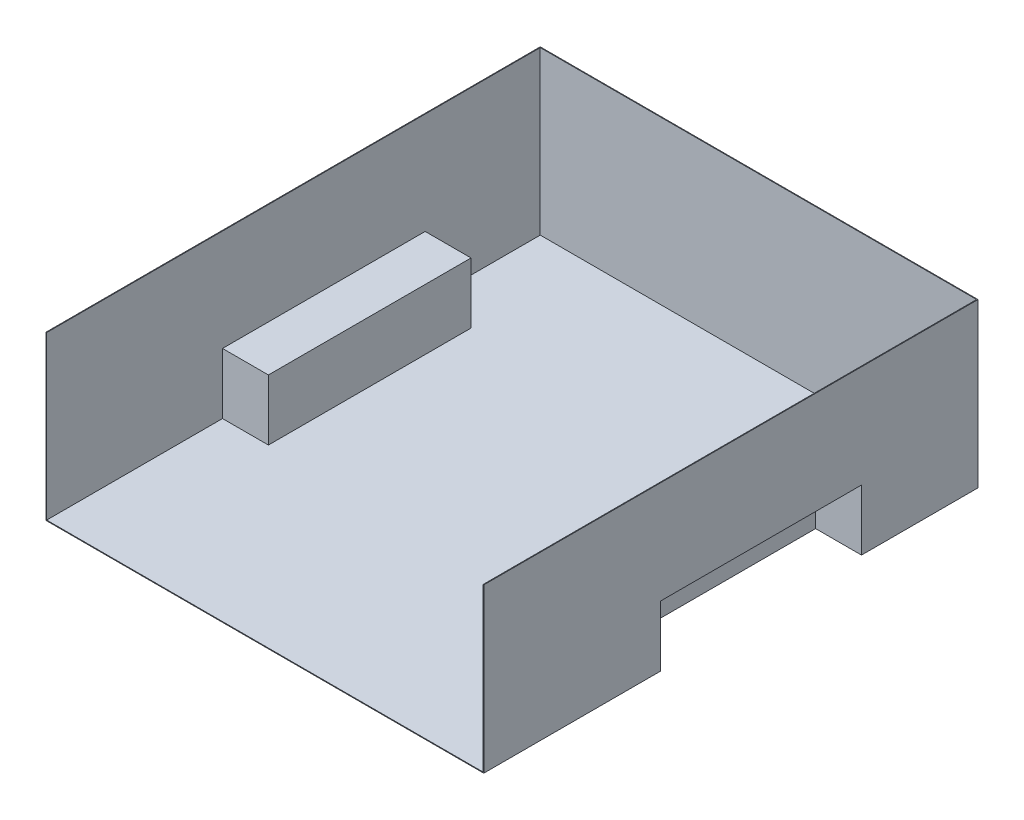
ISO-10303-21;
HEADER;
FILE_DESCRIPTION(('STEP AP214'),'2;1');
FILE_NAME('part.step','',(''),(''),'','','');
FILE_SCHEMA(('AUTOMOTIVE_DESIGN { 1 0 10303 214 1 1 1 1 }'));
ENDSEC;
DATA;
#1=APPLICATION_CONTEXT('core data for automotive mechanical design processes');
#2=APPLICATION_PROTOCOL_DEFINITION('international standard','automotive_design',2000,#1);
#3=PRODUCT_CONTEXT('',#1,'mechanical');
#4=PRODUCT('Part','Part','',(#3));
#5=PRODUCT_RELATED_PRODUCT_CATEGORY('part','',(#4));
#6=PRODUCT_DEFINITION_FORMATION('','',#4);
#7=PRODUCT_DEFINITION_CONTEXT('part definition',#1,'design');
#8=PRODUCT_DEFINITION('design','',#6,#7);
#9=PRODUCT_DEFINITION_SHAPE('','',#8);
#10=(LENGTH_UNIT() NAMED_UNIT(*) SI_UNIT(.MILLI.,.METRE.));
#11=(NAMED_UNIT(*) PLANE_ANGLE_UNIT() SI_UNIT($,.RADIAN.));
#12=(NAMED_UNIT(*) SI_UNIT($,.STERADIAN.) SOLID_ANGLE_UNIT());
#13=UNCERTAINTY_MEASURE_WITH_UNIT(LENGTH_MEASURE(1.E-05),#10,'distance_accuracy_value','');
#14=(GEOMETRIC_REPRESENTATION_CONTEXT(3) GLOBAL_UNCERTAINTY_ASSIGNED_CONTEXT((#13)) GLOBAL_UNIT_ASSIGNED_CONTEXT((#10,
#11,#12)) REPRESENTATION_CONTEXT('',''));
#15=CARTESIAN_POINT('',(0.,0.,0.));
#16=DIRECTION('',(0.,0.,1.));
#17=DIRECTION('',(1.,0.,0.));
#18=AXIS2_PLACEMENT_3D('',#15,#16,#17);
#19=CARTESIAN_POINT('',(-787.4,215.9,-889.));
#20=DIRECTION('',(0.,0.,1.));
#21=DIRECTION('',(1.,0.,0.));
#22=AXIS2_PLACEMENT_3D('',#19,#20,#21);
#23=PLANE('',#22);
#24=DIRECTION('',(0.,-1.,0.));
#25=VECTOR('',#24,1.);
#26=CARTESIAN_POINT('',(787.4,215.9,-889.));
#27=LINE('',#26,#25);
#28=CARTESIAN_POINT('',(787.4,584.2,-889.));
#29=VERTEX_POINT('',#28);
#30=CARTESIAN_POINT('',(787.4,-2.54,-889.));
#31=VERTEX_POINT('',#30);
#32=EDGE_CURVE('E114',#29,#31,#27,.T.);
#33=ORIENTED_EDGE('',*,*,#32,.T.);
#34=DIRECTION('',(1.,0.,0.));
#35=VECTOR('',#34,1.);
#36=CARTESIAN_POINT('',(-787.4,-2.54,-889.));
#37=LINE('',#36,#35);
#38=CARTESIAN_POINT('',(-787.4,-2.54,-889.));
#39=VERTEX_POINT('',#38);
#40=EDGE_CURVE('E298',#39,#31,#37,.T.);
#41=ORIENTED_EDGE('',*,*,#40,.F.);
#42=DIRECTION('',(0.,-1.,0.));
#43=VECTOR('',#42,1.);
#44=CARTESIAN_POINT('',(-787.4,215.9,-889.));
#45=LINE('',#44,#43);
#46=CARTESIAN_POINT('',(-787.4,584.2,-889.));
#47=VERTEX_POINT('',#46);
#48=EDGE_CURVE('E453',#47,#39,#45,.T.);
#49=ORIENTED_EDGE('',*,*,#48,.F.);
#50=DIRECTION('',(-1.,0.,0.));
#51=VECTOR('',#50,1.);
#52=CARTESIAN_POINT('',(-787.4,584.2,-889.));
#53=LINE('',#52,#51);
#54=EDGE_CURVE('E352',#29,#47,#53,.T.);
#55=ORIENTED_EDGE('',*,*,#54,.F.);
#56=EDGE_LOOP('',(#33,#41,#49,#55));
#57=FACE_BOUND('',#56,.T.);
#58=ADVANCED_FACE('F107',(#57),#23,.F.);
#59=CARTESIAN_POINT('',(-787.4,215.9,-469.9));
#60=DIRECTION('',(0.,0.,-1.));
#61=DIRECTION('',(-1.,0.,0.));
#62=AXIS2_PLACEMENT_3D('',#59,#60,#61);
#63=PLANE('',#62);
#64=DIRECTION('',(0.,-1.,0.));
#65=VECTOR('',#64,1.);
#66=CARTESIAN_POINT('',(-787.4,215.9,-469.9));
#67=LINE('',#66,#65);
#68=CARTESIAN_POINT('',(-787.4,215.9,-469.9));
#69=VERTEX_POINT('',#68);
#70=CARTESIAN_POINT('',(-787.4,-2.54,-469.9));
#71=VERTEX_POINT('',#70);
#72=EDGE_CURVE('E451',#69,#71,#67,.T.);
#73=ORIENTED_EDGE('',*,*,#72,.T.);
#74=DIRECTION('',(-1.,0.,0.));
#75=VECTOR('',#74,1.);
#76=CARTESIAN_POINT('',(-622.3,-2.54,-469.9));
#77=LINE('',#76,#75);
#78=CARTESIAN_POINT('',(-622.3,-2.54,-469.9));
#79=VERTEX_POINT('',#78);
#80=EDGE_CURVE('E330',#79,#71,#77,.T.);
#81=ORIENTED_EDGE('',*,*,#80,.F.);
#82=DIRECTION('',(0.,-1.,0.));
#83=VECTOR('',#82,1.);
#84=CARTESIAN_POINT('',(-622.3,215.9,-469.9));
#85=LINE('',#84,#83);
#86=CARTESIAN_POINT('',(-622.3,215.9,-469.9));
#87=VERTEX_POINT('',#86);
#88=EDGE_CURVE('E449',#87,#79,#85,.T.);
#89=ORIENTED_EDGE('',*,*,#88,.F.);
#90=DIRECTION('',(1.,0.,0.));
#91=VECTOR('',#90,1.);
#92=CARTESIAN_POINT('',(-787.4,215.9,-469.9));
#93=LINE('',#92,#91);
#94=EDGE_CURVE('E420',#69,#87,#93,.T.);
#95=ORIENTED_EDGE('',*,*,#94,.F.);
#96=EDGE_LOOP('',(#73,#81,#89,#95));
#97=FACE_BOUND('',#96,.T.);
#98=ADVANCED_FACE('F490',(#97),#63,.F.);
#99=CARTESIAN_POINT('',(-622.3,215.9,-469.9));
#100=DIRECTION('',(1.,0.,0.));
#101=DIRECTION('',(0.,0.,-1.));
#102=AXIS2_PLACEMENT_3D('',#99,#100,#101);
#103=PLANE('',#102);
#104=ORIENTED_EDGE('',*,*,#88,.T.);
#105=DIRECTION('',(0.,0.,-1.));
#106=VECTOR('',#105,1.);
#107=CARTESIAN_POINT('',(-622.3,-2.54,254.));
#108=LINE('',#107,#106);
#109=CARTESIAN_POINT('',(-622.3,-2.54,254.));
#110=VERTEX_POINT('',#109);
#111=EDGE_CURVE('E327',#110,#79,#108,.T.);
#112=ORIENTED_EDGE('',*,*,#111,.F.);
#113=DIRECTION('',(0.,-1.,0.));
#114=VECTOR('',#113,1.);
#115=CARTESIAN_POINT('',(-622.3,215.9,254.));
#116=LINE('',#115,#114);
#117=CARTESIAN_POINT('',(-622.3,215.9,254.));
#118=VERTEX_POINT('',#117);
#119=EDGE_CURVE('E447',#118,#110,#116,.T.);
#120=ORIENTED_EDGE('',*,*,#119,.F.);
#121=DIRECTION('',(0.,0.,1.));
#122=VECTOR('',#121,1.);
#123=CARTESIAN_POINT('',(-622.3,215.9,-469.9));
#124=LINE('',#123,#122);
#125=EDGE_CURVE('E422',#87,#118,#124,.T.);
#126=ORIENTED_EDGE('',*,*,#125,.F.);
#127=EDGE_LOOP('',(#104,#112,#120,#126));
#128=FACE_BOUND('',#127,.T.);
#129=ADVANCED_FACE('F487',(#128),#103,.F.);
#130=CARTESIAN_POINT('',(-622.3,215.9,254.));
#131=DIRECTION('',(0.,0.,1.));
#132=DIRECTION('',(1.,0.,0.));
#133=AXIS2_PLACEMENT_3D('',#130,#131,#132);
#134=PLANE('',#133);
#135=ORIENTED_EDGE('',*,*,#119,.T.);
#136=DIRECTION('',(1.,0.,0.));
#137=VECTOR('',#136,1.);
#138=CARTESIAN_POINT('',(-787.4,-2.54,254.));
#139=LINE('',#138,#137);
#140=CARTESIAN_POINT('',(-787.4,-2.54,254.));
#141=VERTEX_POINT('',#140);
#142=EDGE_CURVE('E324',#141,#110,#139,.T.);
#143=ORIENTED_EDGE('',*,*,#142,.F.);
#144=DIRECTION('',(0.,-1.,0.));
#145=VECTOR('',#144,1.);
#146=CARTESIAN_POINT('',(-787.4,215.9,254.));
#147=LINE('',#146,#145);
#148=CARTESIAN_POINT('',(-787.4,215.9,254.));
#149=VERTEX_POINT('',#148);
#150=EDGE_CURVE('E445',#149,#141,#147,.T.);
#151=ORIENTED_EDGE('',*,*,#150,.F.);
#152=DIRECTION('',(-1.,0.,0.));
#153=VECTOR('',#152,1.);
#154=CARTESIAN_POINT('',(-622.3,215.9,254.));
#155=LINE('',#154,#153);
#156=EDGE_CURVE('E425',#118,#149,#155,.T.);
#157=ORIENTED_EDGE('',*,*,#156,.F.);
#158=EDGE_LOOP('',(#135,#143,#151,#157));
#159=FACE_BOUND('',#158,.T.);
#160=ADVANCED_FACE('F483',(#159),#134,.F.);
#161=CARTESIAN_POINT('',(-787.4,215.9,889.));
#162=DIRECTION('',(1.,0.,0.));
#163=DIRECTION('',(0.,0.,-1.));
#164=AXIS2_PLACEMENT_3D('',#161,#162,#163);
#165=PLANE('',#164);
#166=DIRECTION('',(0.,0.,1.));
#167=VECTOR('',#166,1.);
#168=CARTESIAN_POINT('',(-787.4,584.2,-889.));
#169=LINE('',#168,#167);
#170=CARTESIAN_POINT('',(-787.4,584.2,889.));
#171=VERTEX_POINT('',#170);
#172=EDGE_CURVE('E343',#47,#171,#169,.T.);
#173=ORIENTED_EDGE('',*,*,#172,.F.);
#174=ORIENTED_EDGE('',*,*,#48,.T.);
#175=DIRECTION('',(0.,0.,-1.));
#176=VECTOR('',#175,1.);
#177=CARTESIAN_POINT('',(-787.4,-2.54,-469.9));
#178=LINE('',#177,#176);
#179=EDGE_CURVE('E333',#71,#39,#178,.T.);
#180=ORIENTED_EDGE('',*,*,#179,.F.);
#181=ORIENTED_EDGE('',*,*,#72,.F.);
#182=DIRECTION('',(0.,0.,1.));
#183=VECTOR('',#182,1.);
#184=CARTESIAN_POINT('',(-787.4,215.9,-472.44));
#185=LINE('',#184,#183);
#186=EDGE_CURVE('E366',#69,#149,#185,.T.);
#187=ORIENTED_EDGE('',*,*,#186,.T.);
#188=ORIENTED_EDGE('',*,*,#150,.T.);
#189=DIRECTION('',(0.,0.,-1.));
#190=VECTOR('',#189,1.);
#191=CARTESIAN_POINT('',(-787.4,-2.54,889.));
#192=LINE('',#191,#190);
#193=CARTESIAN_POINT('',(-787.4,-2.54,889.));
#194=VERTEX_POINT('',#193);
#195=EDGE_CURVE('E321',#194,#141,#192,.T.);
#196=ORIENTED_EDGE('',*,*,#195,.F.);
#197=DIRECTION('',(0.,-1.,0.));
#198=VECTOR('',#197,1.);
#199=CARTESIAN_POINT('',(-787.4,215.9,889.));
#200=LINE('',#199,#198);
#201=EDGE_CURVE('E443',#171,#194,#200,.T.);
#202=ORIENTED_EDGE('',*,*,#201,.F.);
#203=EDGE_LOOP('',(#173,#174,#180,#181,#187,#188,#196,#202));
#204=FACE_BOUND('',#203,.T.);
#205=ADVANCED_FACE('F469',(#204),#165,.F.);
#206=CARTESIAN_POINT('',(-787.4,215.9,889.));
#207=DIRECTION('',(0.,0.,-1.));
#208=DIRECTION('',(-1.,0.,0.));
#209=AXIS2_PLACEMENT_3D('',#206,#207,#208);
#210=PLANE('',#209);
#211=DIRECTION('',(1.,0.,0.));
#212=VECTOR('',#211,1.);
#213=CARTESIAN_POINT('',(-787.4,584.2,889.));
#214=LINE('',#213,#212);
#215=CARTESIAN_POINT('',(784.86,584.2,889.));
#216=VERTEX_POINT('',#215);
#217=CARTESIAN_POINT('',(787.4,584.2,889.));
#218=VERTEX_POINT('',#217);
#219=EDGE_CURVE('E295',#216,#218,#214,.T.);
#220=ORIENTED_EDGE('',*,*,#219,.F.);
#221=DIRECTION('',(0.,1.,0.));
#222=VECTOR('',#221,1.);
#223=CARTESIAN_POINT('',(784.86,-1569.72205501484,889.));
#224=LINE('',#223,#222);
#225=CARTESIAN_POINT('',(784.86,0.,889.));
#226=VERTEX_POINT('',#225);
#227=EDGE_CURVE('E275',#226,#216,#224,.T.);
#228=ORIENTED_EDGE('',*,*,#227,.F.);
#229=DIRECTION('',(1.,0.,0.));
#230=VECTOR('',#229,1.);
#231=CARTESIAN_POINT('',(-784.86,0.,889.));
#232=LINE('',#231,#230);
#233=CARTESIAN_POINT('',(-784.86,0.,889.));
#234=VERTEX_POINT('',#233);
#235=EDGE_CURVE('E285',#234,#226,#232,.T.);
#236=ORIENTED_EDGE('',*,*,#235,.F.);
#237=DIRECTION('',(0.,1.,0.));
#238=VECTOR('',#237,1.);
#239=CARTESIAN_POINT('',(-784.86,-1569.72205501484,889.));
#240=LINE('',#239,#238);
#241=CARTESIAN_POINT('',(-784.86,584.2,889.));
#242=VERTEX_POINT('',#241);
#243=EDGE_CURVE('E296',#234,#242,#240,.T.);
#244=ORIENTED_EDGE('',*,*,#243,.T.);
#245=EDGE_CURVE('E346',#171,#242,#214,.T.);
#246=ORIENTED_EDGE('',*,*,#245,.F.);
#247=ORIENTED_EDGE('',*,*,#201,.T.);
#248=DIRECTION('',(-1.,0.,0.));
#249=VECTOR('',#248,1.);
#250=CARTESIAN_POINT('',(787.4,-2.54,889.));
#251=LINE('',#250,#249);
#252=CARTESIAN_POINT('',(787.4,-2.54,889.));
#253=VERTEX_POINT('',#252);
#254=EDGE_CURVE('E318',#253,#194,#251,.T.);
#255=ORIENTED_EDGE('',*,*,#254,.F.);
#256=DIRECTION('',(0.,-1.,0.));
#257=VECTOR('',#256,1.);
#258=CARTESIAN_POINT('',(787.4,215.9,889.));
#259=LINE('',#258,#257);
#260=EDGE_CURVE('E441',#218,#253,#259,.T.);
#261=ORIENTED_EDGE('',*,*,#260,.F.);
#262=EDGE_LOOP('',(#220,#228,#236,#244,#246,#247,#255,#261));
#263=FACE_BOUND('',#262,.T.);
#264=ADVANCED_FACE('F293',(#263),#210,.F.);
#265=CARTESIAN_POINT('',(787.4,215.9,889.));
#266=DIRECTION('',(-1.,0.,0.));
#267=DIRECTION('',(0.,0.,1.));
#268=AXIS2_PLACEMENT_3D('',#265,#266,#267);
#269=PLANE('',#268);
#270=DIRECTION('',(0.,0.,-1.));
#271=VECTOR('',#270,1.);
#272=CARTESIAN_POINT('',(787.4,584.2,-889.));
#273=LINE('',#272,#271);
#274=EDGE_CURVE('E349',#218,#29,#273,.T.);
#275=ORIENTED_EDGE('',*,*,#274,.F.);
#276=ORIENTED_EDGE('',*,*,#260,.T.);
#277=DIRECTION('',(0.,0.,1.));
#278=VECTOR('',#277,1.);
#279=CARTESIAN_POINT('',(787.4,-2.54,254.));
#280=LINE('',#279,#278);
#281=CARTESIAN_POINT('',(787.4,-2.54,254.));
#282=VERTEX_POINT('',#281);
#283=EDGE_CURVE('E315',#282,#253,#280,.T.);
#284=ORIENTED_EDGE('',*,*,#283,.F.);
#285=DIRECTION('',(0.,-1.,0.));
#286=VECTOR('',#285,1.);
#287=CARTESIAN_POINT('',(787.4,215.9,254.));
#288=LINE('',#287,#286);
#289=CARTESIAN_POINT('',(787.4,215.9,254.));
#290=VERTEX_POINT('',#289);
#291=EDGE_CURVE('E439',#290,#282,#288,.T.);
#292=ORIENTED_EDGE('',*,*,#291,.F.);
#293=DIRECTION('',(0.,0.,-1.));
#294=VECTOR('',#293,1.);
#295=CARTESIAN_POINT('',(787.4,215.9,-472.44));
#296=LINE('',#295,#294);
#297=CARTESIAN_POINT('',(787.4,215.9,-469.9));
#298=VERTEX_POINT('',#297);
#299=EDGE_CURVE('E357',#290,#298,#296,.T.);
#300=ORIENTED_EDGE('',*,*,#299,.T.);
#301=DIRECTION('',(0.,-1.,0.));
#302=VECTOR('',#301,1.);
#303=CARTESIAN_POINT('',(787.4,215.9,-469.9));
#304=LINE('',#303,#302);
#305=CARTESIAN_POINT('',(787.4,-2.54,-469.9));
#306=VERTEX_POINT('',#305);
#307=EDGE_CURVE('E433',#298,#306,#304,.T.);
#308=ORIENTED_EDGE('',*,*,#307,.T.);
#309=DIRECTION('',(0.,0.,1.));
#310=VECTOR('',#309,1.);
#311=CARTESIAN_POINT('',(787.4,-2.54,-889.));
#312=LINE('',#311,#310);
#313=EDGE_CURVE('E303',#31,#306,#312,.T.);
#314=ORIENTED_EDGE('',*,*,#313,.F.);
#315=ORIENTED_EDGE('',*,*,#32,.F.);
#316=EDGE_LOOP('',(#275,#276,#284,#292,#300,#308,#314,#315));
#317=FACE_BOUND('',#316,.T.);
#318=ADVANCED_FACE('F460',(#317),#269,.F.);
#319=CARTESIAN_POINT('',(787.4,215.9,254.));
#320=DIRECTION('',(0.,0.,1.));
#321=DIRECTION('',(1.,0.,0.));
#322=AXIS2_PLACEMENT_3D('',#319,#320,#321);
#323=PLANE('',#322);
#324=ORIENTED_EDGE('',*,*,#291,.T.);
#325=DIRECTION('',(1.,0.,0.));
#326=VECTOR('',#325,1.);
#327=CARTESIAN_POINT('',(622.3,-2.54,254.));
#328=LINE('',#327,#326);
#329=CARTESIAN_POINT('',(622.3,-2.54,254.));
#330=VERTEX_POINT('',#329);
#331=EDGE_CURVE('E312',#330,#282,#328,.T.);
#332=ORIENTED_EDGE('',*,*,#331,.F.);
#333=DIRECTION('',(0.,-1.,0.));
#334=VECTOR('',#333,1.);
#335=CARTESIAN_POINT('',(622.3,215.9,254.));
#336=LINE('',#335,#334);
#337=CARTESIAN_POINT('',(622.3,215.9,254.));
#338=VERTEX_POINT('',#337);
#339=EDGE_CURVE('E437',#338,#330,#336,.T.);
#340=ORIENTED_EDGE('',*,*,#339,.F.);
#341=DIRECTION('',(-1.,0.,0.));
#342=VECTOR('',#341,1.);
#343=CARTESIAN_POINT('',(787.4,215.9,254.));
#344=LINE('',#343,#342);
#345=EDGE_CURVE('E427',#290,#338,#344,.T.);
#346=ORIENTED_EDGE('',*,*,#345,.F.);
#347=EDGE_LOOP('',(#324,#332,#340,#346));
#348=FACE_BOUND('',#347,.T.);
#349=ADVANCED_FACE('F526',(#348),#323,.F.);
#350=CARTESIAN_POINT('',(622.3,215.9,254.));
#351=DIRECTION('',(-1.,0.,0.));
#352=DIRECTION('',(0.,0.,1.));
#353=AXIS2_PLACEMENT_3D('',#350,#351,#352);
#354=PLANE('',#353);
#355=ORIENTED_EDGE('',*,*,#339,.T.);
#356=DIRECTION('',(0.,0.,1.));
#357=VECTOR('',#356,1.);
#358=CARTESIAN_POINT('',(622.3,-2.54,-469.9));
#359=LINE('',#358,#357);
#360=CARTESIAN_POINT('',(622.3,-2.54,-469.9));
#361=VERTEX_POINT('',#360);
#362=EDGE_CURVE('E309',#361,#330,#359,.T.);
#363=ORIENTED_EDGE('',*,*,#362,.F.);
#364=DIRECTION('',(0.,-1.,0.));
#365=VECTOR('',#364,1.);
#366=CARTESIAN_POINT('',(622.3,215.9,-469.9));
#367=LINE('',#366,#365);
#368=CARTESIAN_POINT('',(622.3,215.9,-469.9));
#369=VERTEX_POINT('',#368);
#370=EDGE_CURVE('E435',#369,#361,#367,.T.);
#371=ORIENTED_EDGE('',*,*,#370,.F.);
#372=DIRECTION('',(0.,0.,-1.));
#373=VECTOR('',#372,1.);
#374=CARTESIAN_POINT('',(622.3,215.9,254.));
#375=LINE('',#374,#373);
#376=EDGE_CURVE('E429',#338,#369,#375,.T.);
#377=ORIENTED_EDGE('',*,*,#376,.F.);
#378=EDGE_LOOP('',(#355,#363,#371,#377));
#379=FACE_BOUND('',#378,.T.);
#380=ADVANCED_FACE('F529',(#379),#354,.F.);
#381=CARTESIAN_POINT('',(622.3,215.9,-469.9));
#382=DIRECTION('',(0.,0.,-1.));
#383=DIRECTION('',(-1.,0.,0.));
#384=AXIS2_PLACEMENT_3D('',#381,#382,#383);
#385=PLANE('',#384);
#386=ORIENTED_EDGE('',*,*,#370,.T.);
#387=DIRECTION('',(-1.,0.,0.));
#388=VECTOR('',#387,1.);
#389=CARTESIAN_POINT('',(787.4,-2.54,-469.9));
#390=LINE('',#389,#388);
#391=EDGE_CURVE('E306',#306,#361,#390,.T.);
#392=ORIENTED_EDGE('',*,*,#391,.F.);
#393=ORIENTED_EDGE('',*,*,#307,.F.);
#394=DIRECTION('',(1.,0.,0.));
#395=VECTOR('',#394,1.);
#396=CARTESIAN_POINT('',(622.3,215.9,-469.9));
#397=LINE('',#396,#395);
#398=EDGE_CURVE('E431',#369,#298,#397,.T.);
#399=ORIENTED_EDGE('',*,*,#398,.F.);
#400=EDGE_LOOP('',(#386,#392,#393,#399));
#401=FACE_BOUND('',#400,.T.);
#402=ADVANCED_FACE('F533',(#401),#385,.F.);
#403=CARTESIAN_POINT('',(784.86,215.9,0.));
#404=DIRECTION('',(-1.,0.,0.));
#405=DIRECTION('',(0.,0.,1.));
#406=AXIS2_PLACEMENT_3D('',#403,#404,#405);
#407=PLANE('',#406);
#408=DIRECTION('',(0.,0.,-1.));
#409=VECTOR('',#408,1.);
#410=CARTESIAN_POINT('',(784.86,0.,0.));
#411=LINE('',#410,#409);
#412=CARTESIAN_POINT('',(784.86,0.,-472.44));
#413=VERTEX_POINT('',#412);
#414=CARTESIAN_POINT('',(784.86,0.,-886.46));
#415=VERTEX_POINT('',#414);
#416=EDGE_CURVE('E376',#413,#415,#411,.T.);
#417=ORIENTED_EDGE('',*,*,#416,.F.);
#418=DIRECTION('',(0.,-1.,0.));
#419=VECTOR('',#418,1.);
#420=CARTESIAN_POINT('',(784.86,215.9,-472.44));
#421=LINE('',#420,#419);
#422=CARTESIAN_POINT('',(784.86,218.44,-472.44));
#423=VERTEX_POINT('',#422);
#424=EDGE_CURVE('E402',#423,#413,#421,.T.);
#425=ORIENTED_EDGE('',*,*,#424,.F.);
#426=DIRECTION('',(0.,0.,1.));
#427=VECTOR('',#426,1.);
#428=CARTESIAN_POINT('',(784.86,218.44,0.));
#429=LINE('',#428,#427);
#430=CARTESIAN_POINT('',(784.86,218.44,256.54));
#431=VERTEX_POINT('',#430);
#432=EDGE_CURVE('E12',#423,#431,#429,.T.);
#433=ORIENTED_EDGE('',*,*,#432,.T.);
#434=DIRECTION('',(0.,-1.,0.));
#435=VECTOR('',#434,1.);
#436=CARTESIAN_POINT('',(784.86,215.9,256.54));
#437=LINE('',#436,#435);
#438=CARTESIAN_POINT('',(784.86,0.,256.54));
#439=VERTEX_POINT('',#438);
#440=EDGE_CURVE('E277',#431,#439,#437,.T.);
#441=ORIENTED_EDGE('',*,*,#440,.T.);
#442=DIRECTION('',(0.,0.,-1.));
#443=VECTOR('',#442,1.);
#444=CARTESIAN_POINT('',(784.86,0.,0.));
#445=LINE('',#444,#443);
#446=EDGE_CURVE('E269',#226,#439,#445,.T.);
#447=ORIENTED_EDGE('',*,*,#446,.F.);
#448=ORIENTED_EDGE('',*,*,#227,.T.);
#449=DIRECTION('',(0.,0.,-1.));
#450=VECTOR('',#449,1.);
#451=CARTESIAN_POINT('',(784.86,584.2,-886.46));
#452=LINE('',#451,#450);
#453=CARTESIAN_POINT('',(784.86,584.2,-886.46));
#454=VERTEX_POINT('',#453);
#455=EDGE_CURVE('E341',#216,#454,#452,.T.);
#456=ORIENTED_EDGE('',*,*,#455,.T.);
#457=DIRECTION('',(0.,-1.,0.));
#458=VECTOR('',#457,1.);
#459=CARTESIAN_POINT('',(784.86,215.9,-886.46));
#460=LINE('',#459,#458);
#461=EDGE_CURVE('E417',#454,#415,#460,.T.);
#462=ORIENTED_EDGE('',*,*,#461,.T.);
#463=EDGE_LOOP('',(#417,#425,#433,#441,#447,#448,#456,#462));
#464=FACE_BOUND('',#463,.T.);
#465=ADVANCED_FACE('F272',(#464),#407,.T.);
#466=CARTESIAN_POINT('',(0.,215.9,-886.46));
#467=DIRECTION('',(0.,0.,1.));
#468=DIRECTION('',(1.,0.,0.));
#469=AXIS2_PLACEMENT_3D('',#466,#467,#468);
#470=PLANE('',#469);
#471=DIRECTION('',(-1.,0.,0.));
#472=VECTOR('',#471,1.);
#473=CARTESIAN_POINT('',(0.,0.,-886.46));
#474=LINE('',#473,#472);
#475=CARTESIAN_POINT('',(-784.86,0.,-886.46));
#476=VERTEX_POINT('',#475);
#477=EDGE_CURVE('E381',#415,#476,#474,.T.);
#478=ORIENTED_EDGE('',*,*,#477,.F.);
#479=ORIENTED_EDGE('',*,*,#461,.F.);
#480=DIRECTION('',(-1.,0.,0.));
#481=VECTOR('',#480,1.);
#482=CARTESIAN_POINT('',(-784.86,584.2,-886.46));
#483=LINE('',#482,#481);
#484=CARTESIAN_POINT('',(-784.86,584.2,-886.46));
#485=VERTEX_POINT('',#484);
#486=EDGE_CURVE('E336',#454,#485,#483,.T.);
#487=ORIENTED_EDGE('',*,*,#486,.T.);
#488=DIRECTION('',(0.,-1.,0.));
#489=VECTOR('',#488,1.);
#490=CARTESIAN_POINT('',(-784.86,215.9,-886.46));
#491=LINE('',#490,#489);
#492=EDGE_CURVE('E415',#485,#476,#491,.T.);
#493=ORIENTED_EDGE('',*,*,#492,.T.);
#494=EDGE_LOOP('',(#478,#479,#487,#493));
#495=FACE_BOUND('',#494,.T.);
#496=ADVANCED_FACE('F540',(#495),#470,.T.);
#497=CARTESIAN_POINT('',(-784.86,215.9,0.));
#498=DIRECTION('',(1.,0.,0.));
#499=DIRECTION('',(0.,0.,-1.));
#500=AXIS2_PLACEMENT_3D('',#497,#498,#499);
#501=PLANE('',#500);
#502=DIRECTION('',(0.,0.,1.));
#503=VECTOR('',#502,1.);
#504=CARTESIAN_POINT('',(-784.86,0.,0.));
#505=LINE('',#504,#503);
#506=CARTESIAN_POINT('',(-784.86,0.,-472.44));
#507=VERTEX_POINT('',#506);
#508=EDGE_CURVE('E384',#476,#507,#505,.T.);
#509=ORIENTED_EDGE('',*,*,#508,.F.);
#510=ORIENTED_EDGE('',*,*,#492,.F.);
#511=DIRECTION('',(0.,0.,1.));
#512=VECTOR('',#511,1.);
#513=CARTESIAN_POINT('',(-784.86,584.2,-886.46));
#514=LINE('',#513,#512);
#515=EDGE_CURVE('E339',#485,#242,#514,.T.);
#516=ORIENTED_EDGE('',*,*,#515,.T.);
#517=ORIENTED_EDGE('',*,*,#243,.F.);
#518=DIRECTION('',(0.,0.,1.));
#519=VECTOR('',#518,1.);
#520=CARTESIAN_POINT('',(-784.86,0.,0.));
#521=LINE('',#520,#519);
#522=CARTESIAN_POINT('',(-784.86,0.,256.54));
#523=VERTEX_POINT('',#522);
#524=EDGE_CURVE('E282',#523,#234,#521,.T.);
#525=ORIENTED_EDGE('',*,*,#524,.F.);
#526=DIRECTION('',(0.,-1.,0.));
#527=VECTOR('',#526,1.);
#528=CARTESIAN_POINT('',(-784.86,215.9,256.54));
#529=LINE('',#528,#527);
#530=CARTESIAN_POINT('',(-784.86,218.44,256.54));
#531=VERTEX_POINT('',#530);
#532=EDGE_CURVE('E121',#531,#523,#529,.T.);
#533=ORIENTED_EDGE('',*,*,#532,.F.);
#534=DIRECTION('',(0.,0.,1.));
#535=VECTOR('',#534,1.);
#536=CARTESIAN_POINT('',(-784.86,218.44,0.));
#537=LINE('',#536,#535);
#538=CARTESIAN_POINT('',(-784.86,218.44,-472.44));
#539=VERTEX_POINT('',#538);
#540=EDGE_CURVE('E355',#539,#531,#537,.T.);
#541=ORIENTED_EDGE('',*,*,#540,.F.);
#542=DIRECTION('',(0.,-1.,0.));
#543=VECTOR('',#542,1.);
#544=CARTESIAN_POINT('',(-784.86,215.9,-472.44));
#545=LINE('',#544,#543);
#546=EDGE_CURVE('E129',#539,#507,#545,.T.);
#547=ORIENTED_EDGE('',*,*,#546,.T.);
#548=EDGE_LOOP('',(#509,#510,#516,#517,#525,#533,#541,#547));
#549=FACE_BOUND('',#548,.T.);
#550=ADVANCED_FACE('F543',(#549),#501,.T.);
#551=CARTESIAN_POINT('',(0.,215.9,-472.44));
#552=DIRECTION('',(0.,0.,-1.));
#553=DIRECTION('',(-1.,0.,0.));
#554=AXIS2_PLACEMENT_3D('',#551,#552,#553);
#555=PLANE('',#554);
#556=ORIENTED_EDGE('',*,*,#546,.F.);
#557=DIRECTION('',(-1.,0.,0.));
#558=VECTOR('',#557,1.);
#559=CARTESIAN_POINT('',(-619.76,218.44,-472.44));
#560=LINE('',#559,#558);
#561=CARTESIAN_POINT('',(-619.76,218.44,-472.44));
#562=VERTEX_POINT('',#561);
#563=EDGE_CURVE('E372',#562,#539,#560,.T.);
#564=ORIENTED_EDGE('',*,*,#563,.F.);
#565=DIRECTION('',(0.,-1.,0.));
#566=VECTOR('',#565,1.);
#567=CARTESIAN_POINT('',(-619.76,215.9,-472.44));
#568=LINE('',#567,#566);
#569=CARTESIAN_POINT('',(-619.76,0.,-472.44));
#570=VERTEX_POINT('',#569);
#571=EDGE_CURVE('E412',#562,#570,#568,.T.);
#572=ORIENTED_EDGE('',*,*,#571,.T.);
#573=DIRECTION('',(1.,0.,0.));
#574=VECTOR('',#573,1.);
#575=CARTESIAN_POINT('',(0.,0.,-472.44));
#576=LINE('',#575,#574);
#577=EDGE_CURVE('E386',#507,#570,#576,.T.);
#578=ORIENTED_EDGE('',*,*,#577,.F.);
#579=EDGE_LOOP('',(#556,#564,#572,#578));
#580=FACE_BOUND('',#579,.T.);
#581=ADVANCED_FACE('F547',(#580),#555,.T.);
#582=CARTESIAN_POINT('',(-619.76,215.9,0.));
#583=DIRECTION('',(1.,0.,0.));
#584=DIRECTION('',(0.,0.,-1.));
#585=AXIS2_PLACEMENT_3D('',#582,#583,#584);
#586=PLANE('',#585);
#587=DIRECTION('',(0.,0.,1.));
#588=VECTOR('',#587,1.);
#589=CARTESIAN_POINT('',(-619.76,0.,0.));
#590=LINE('',#589,#588);
#591=CARTESIAN_POINT('',(-619.76,0.,256.54));
#592=VERTEX_POINT('',#591);
#593=EDGE_CURVE('E389',#570,#592,#590,.T.);
#594=ORIENTED_EDGE('',*,*,#593,.F.);
#595=ORIENTED_EDGE('',*,*,#571,.F.);
#596=DIRECTION('',(0.,0.,-1.));
#597=VECTOR('',#596,1.);
#598=CARTESIAN_POINT('',(-619.76,218.44,-472.44));
#599=LINE('',#598,#597);
#600=CARTESIAN_POINT('',(-619.76,218.44,256.54));
#601=VERTEX_POINT('',#600);
#602=EDGE_CURVE('E369',#601,#562,#599,.T.);
#603=ORIENTED_EDGE('',*,*,#602,.F.);
#604=DIRECTION('',(0.,-1.,0.));
#605=VECTOR('',#604,1.);
#606=CARTESIAN_POINT('',(-619.76,215.9,256.54));
#607=LINE('',#606,#605);
#608=EDGE_CURVE('E410',#601,#592,#607,.T.);
#609=ORIENTED_EDGE('',*,*,#608,.T.);
#610=EDGE_LOOP('',(#594,#595,#603,#609));
#611=FACE_BOUND('',#610,.T.);
#612=ADVANCED_FACE('F550',(#611),#586,.T.);
#613=CARTESIAN_POINT('',(0.,215.9,256.54));
#614=DIRECTION('',(0.,0.,1.));
#615=DIRECTION('',(1.,0.,0.));
#616=AXIS2_PLACEMENT_3D('',#613,#614,#615);
#617=PLANE('',#616);
#618=DIRECTION('',(1.,0.,0.));
#619=VECTOR('',#618,1.);
#620=CARTESIAN_POINT('',(-619.76,218.44,256.54));
#621=LINE('',#620,#619);
#622=EDGE_CURVE('E374',#531,#601,#621,.T.);
#623=ORIENTED_EDGE('',*,*,#622,.F.);
#624=ORIENTED_EDGE('',*,*,#532,.T.);
#625=DIRECTION('',(-1.,0.,0.));
#626=VECTOR('',#625,1.);
#627=CARTESIAN_POINT('',(0.,0.,256.54));
#628=LINE('',#627,#626);
#629=EDGE_CURVE('E392',#592,#523,#628,.T.);
#630=ORIENTED_EDGE('',*,*,#629,.F.);
#631=ORIENTED_EDGE('',*,*,#608,.F.);
#632=EDGE_LOOP('',(#623,#624,#630,#631));
#633=FACE_BOUND('',#632,.T.);
#634=ADVANCED_FACE('F553',(#633),#617,.T.);
#635=CARTESIAN_POINT('',(0.,215.9,256.54));
#636=DIRECTION('',(0.,0.,1.));
#637=DIRECTION('',(1.,0.,0.));
#638=AXIS2_PLACEMENT_3D('',#635,#636,#637);
#639=PLANE('',#638);
#640=ORIENTED_EDGE('',*,*,#440,.F.);
#641=DIRECTION('',(1.,0.,0.));
#642=VECTOR('',#641,1.);
#643=CARTESIAN_POINT('',(619.76,218.44,256.54));
#644=LINE('',#643,#642);
#645=CARTESIAN_POINT('',(619.76,218.44,256.54));
#646=VERTEX_POINT('',#645);
#647=EDGE_CURVE('E361',#646,#431,#644,.T.);
#648=ORIENTED_EDGE('',*,*,#647,.F.);
#649=DIRECTION('',(0.,-1.,0.));
#650=VECTOR('',#649,1.);
#651=CARTESIAN_POINT('',(619.76,215.9,256.54));
#652=LINE('',#651,#650);
#653=CARTESIAN_POINT('',(619.76,0.,256.54));
#654=VERTEX_POINT('',#653);
#655=EDGE_CURVE('E406',#646,#654,#652,.T.);
#656=ORIENTED_EDGE('',*,*,#655,.T.);
#657=DIRECTION('',(-1.,0.,0.));
#658=VECTOR('',#657,1.);
#659=CARTESIAN_POINT('',(0.,0.,256.54));
#660=LINE('',#659,#658);
#661=EDGE_CURVE('E281',#439,#654,#660,.T.);
#662=ORIENTED_EDGE('',*,*,#661,.F.);
#663=EDGE_LOOP('',(#640,#648,#656,#662));
#664=FACE_BOUND('',#663,.T.);
#665=ADVANCED_FACE('F557',(#664),#639,.T.);
#666=CARTESIAN_POINT('',(619.76,215.9,0.));
#667=DIRECTION('',(-1.,0.,0.));
#668=DIRECTION('',(0.,0.,1.));
#669=AXIS2_PLACEMENT_3D('',#666,#667,#668);
#670=PLANE('',#669);
#671=DIRECTION('',(0.,0.,-1.));
#672=VECTOR('',#671,1.);
#673=CARTESIAN_POINT('',(619.76,0.,0.));
#674=LINE('',#673,#672);
#675=CARTESIAN_POINT('',(619.76,0.,-472.44));
#676=VERTEX_POINT('',#675);
#677=EDGE_CURVE('E396',#654,#676,#674,.T.);
#678=ORIENTED_EDGE('',*,*,#677,.F.);
#679=ORIENTED_EDGE('',*,*,#655,.F.);
#680=DIRECTION('',(0.,0.,1.));
#681=VECTOR('',#680,1.);
#682=CARTESIAN_POINT('',(619.76,218.44,-472.44));
#683=LINE('',#682,#681);
#684=CARTESIAN_POINT('',(619.76,218.44,-472.44));
#685=VERTEX_POINT('',#684);
#686=EDGE_CURVE('E358',#685,#646,#683,.T.);
#687=ORIENTED_EDGE('',*,*,#686,.F.);
#688=DIRECTION('',(0.,-1.,0.));
#689=VECTOR('',#688,1.);
#690=CARTESIAN_POINT('',(619.76,215.9,-472.44));
#691=LINE('',#690,#689);
#692=EDGE_CURVE('E404',#685,#676,#691,.T.);
#693=ORIENTED_EDGE('',*,*,#692,.T.);
#694=EDGE_LOOP('',(#678,#679,#687,#693));
#695=FACE_BOUND('',#694,.T.);
#696=ADVANCED_FACE('F561',(#695),#670,.T.);
#697=CARTESIAN_POINT('',(0.,215.9,-472.44));
#698=DIRECTION('',(0.,0.,-1.));
#699=DIRECTION('',(-1.,0.,0.));
#700=AXIS2_PLACEMENT_3D('',#697,#698,#699);
#701=PLANE('',#700);
#702=DIRECTION('',(-1.,0.,0.));
#703=VECTOR('',#702,1.);
#704=CARTESIAN_POINT('',(619.76,218.44,-472.44));
#705=LINE('',#704,#703);
#706=EDGE_CURVE('E364',#423,#685,#705,.T.);
#707=ORIENTED_EDGE('',*,*,#706,.F.);
#708=ORIENTED_EDGE('',*,*,#424,.T.);
#709=DIRECTION('',(1.,0.,0.));
#710=VECTOR('',#709,1.);
#711=CARTESIAN_POINT('',(0.,0.,-472.44));
#712=LINE('',#711,#710);
#713=EDGE_CURVE('E399',#676,#413,#712,.T.);
#714=ORIENTED_EDGE('',*,*,#713,.F.);
#715=ORIENTED_EDGE('',*,*,#692,.F.);
#716=EDGE_LOOP('',(#707,#708,#714,#715));
#717=FACE_BOUND('',#716,.T.);
#718=ADVANCED_FACE('F505',(#717),#701,.T.);
#719=CARTESIAN_POINT('',(0.,218.44,0.));
#720=DIRECTION('',(0.,-1.,0.));
#721=DIRECTION('',(0.,0.,-1.));
#722=AXIS2_PLACEMENT_3D('',#719,#720,#721);
#723=PLANE('',#722);
#724=ORIENTED_EDGE('',*,*,#563,.T.);
#725=ORIENTED_EDGE('',*,*,#540,.T.);
#726=ORIENTED_EDGE('',*,*,#622,.T.);
#727=ORIENTED_EDGE('',*,*,#602,.T.);
#728=EDGE_LOOP('',(#724,#725,#726,#727));
#729=FACE_BOUND('',#728,.T.);
#730=ADVANCED_FACE('F496',(#729),#723,.F.);
#731=CARTESIAN_POINT('',(0.,215.9,0.));
#732=DIRECTION('',(0.,-1.,0.));
#733=DIRECTION('',(0.,0.,-1.));
#734=AXIS2_PLACEMENT_3D('',#731,#732,#733);
#735=PLANE('',#734);
#736=ORIENTED_EDGE('',*,*,#156,.T.);
#737=ORIENTED_EDGE('',*,*,#186,.F.);
#738=ORIENTED_EDGE('',*,*,#94,.T.);
#739=ORIENTED_EDGE('',*,*,#125,.T.);
#740=EDGE_LOOP('',(#736,#737,#738,#739));
#741=FACE_BOUND('',#740,.T.);
#742=ADVANCED_FACE('F493',(#741),#735,.T.);
#743=CARTESIAN_POINT('',(0.,215.9,0.));
#744=DIRECTION('',(0.,1.,0.));
#745=DIRECTION('',(0.,0.,1.));
#746=AXIS2_PLACEMENT_3D('',#743,#744,#745);
#747=PLANE('',#746);
#748=ORIENTED_EDGE('',*,*,#398,.T.);
#749=ORIENTED_EDGE('',*,*,#299,.F.);
#750=ORIENTED_EDGE('',*,*,#345,.T.);
#751=ORIENTED_EDGE('',*,*,#376,.T.);
#752=EDGE_LOOP('',(#748,#749,#750,#751));
#753=FACE_BOUND('',#752,.T.);
#754=ADVANCED_FACE('F495',(#753),#747,.F.);
#755=CARTESIAN_POINT('',(0.,218.44,0.));
#756=DIRECTION('',(0.,1.,0.));
#757=DIRECTION('',(0.,0.,1.));
#758=AXIS2_PLACEMENT_3D('',#755,#756,#757);
#759=PLANE('',#758);
#760=ORIENTED_EDGE('',*,*,#432,.F.);
#761=ORIENTED_EDGE('',*,*,#706,.T.);
#762=ORIENTED_EDGE('',*,*,#686,.T.);
#763=ORIENTED_EDGE('',*,*,#647,.T.);
#764=EDGE_LOOP('',(#760,#761,#762,#763));
#765=FACE_BOUND('',#764,.T.);
#766=ADVANCED_FACE('F502',(#765),#759,.T.);
#767=CARTESIAN_POINT('',(0.,584.2,0.));
#768=DIRECTION('',(0.,1.,0.));
#769=DIRECTION('',(0.,0.,1.));
#770=AXIS2_PLACEMENT_3D('',#767,#768,#769);
#771=PLANE('',#770);
#772=ORIENTED_EDGE('',*,*,#455,.F.);
#773=ORIENTED_EDGE('',*,*,#219,.T.);
#774=ORIENTED_EDGE('',*,*,#274,.T.);
#775=ORIENTED_EDGE('',*,*,#54,.T.);
#776=ORIENTED_EDGE('',*,*,#172,.T.);
#777=ORIENTED_EDGE('',*,*,#245,.T.);
#778=ORIENTED_EDGE('',*,*,#515,.F.);
#779=ORIENTED_EDGE('',*,*,#486,.F.);
#780=EDGE_LOOP('',(#772,#773,#774,#775,#776,#777,#778,#779));
#781=FACE_BOUND('',#780,.T.);
#782=ADVANCED_FACE('F472',(#781),#771,.T.);
#783=CARTESIAN_POINT('',(0.,0.,0.));
#784=DIRECTION('',(0.,-1.,0.));
#785=DIRECTION('',(0.,0.,-1.));
#786=AXIS2_PLACEMENT_3D('',#783,#784,#785);
#787=PLANE('',#786);
#788=ORIENTED_EDGE('',*,*,#508,.T.);
#789=ORIENTED_EDGE('',*,*,#577,.T.);
#790=ORIENTED_EDGE('',*,*,#593,.T.);
#791=ORIENTED_EDGE('',*,*,#629,.T.);
#792=ORIENTED_EDGE('',*,*,#524,.T.);
#793=ORIENTED_EDGE('',*,*,#235,.T.);
#794=ORIENTED_EDGE('',*,*,#446,.T.);
#795=ORIENTED_EDGE('',*,*,#661,.T.);
#796=ORIENTED_EDGE('',*,*,#677,.T.);
#797=ORIENTED_EDGE('',*,*,#713,.T.);
#798=ORIENTED_EDGE('',*,*,#416,.T.);
#799=ORIENTED_EDGE('',*,*,#477,.T.);
#800=EDGE_LOOP('',(#788,#789,#790,#791,#792,#793,#794,#795,#796,#797,#798,#799));
#801=FACE_BOUND('',#800,.T.);
#802=ADVANCED_FACE('F287',(#801),#787,.F.);
#803=CARTESIAN_POINT('',(0.,-2.54,0.));
#804=DIRECTION('',(0.,-1.,0.));
#805=DIRECTION('',(0.,0.,-1.));
#806=AXIS2_PLACEMENT_3D('',#803,#804,#805);
#807=PLANE('',#806);
#808=ORIENTED_EDGE('',*,*,#40,.T.);
#809=ORIENTED_EDGE('',*,*,#313,.T.);
#810=ORIENTED_EDGE('',*,*,#391,.T.);
#811=ORIENTED_EDGE('',*,*,#362,.T.);
#812=ORIENTED_EDGE('',*,*,#331,.T.);
#813=ORIENTED_EDGE('',*,*,#283,.T.);
#814=ORIENTED_EDGE('',*,*,#254,.T.);
#815=ORIENTED_EDGE('',*,*,#195,.T.);
#816=ORIENTED_EDGE('',*,*,#142,.T.);
#817=ORIENTED_EDGE('',*,*,#111,.T.);
#818=ORIENTED_EDGE('',*,*,#80,.T.);
#819=ORIENTED_EDGE('',*,*,#179,.T.);
#820=EDGE_LOOP('',(#808,#809,#810,#811,#812,#813,#814,#815,#816,#817,#818,#819));
#821=FACE_BOUND('',#820,.T.);
#822=ADVANCED_FACE('F464',(#821),#807,.T.);
#823=CLOSED_SHELL('',(#58,#98,#129,#160,#205,#264,#318,#349,#380,#402,#465,#496,#550,#581,#612,
#634,#665,#696,#718,#730,#742,#754,#766,#782,#802,#822));
#824=MANIFOLD_SOLID_BREP('B2',#823);
#825=ADVANCED_BREP_SHAPE_REPRESENTATION('',(#18,#824),#14);
#826=SHAPE_DEFINITION_REPRESENTATION(#9,#825);
ENDSEC;
END-ISO-10303-21;
